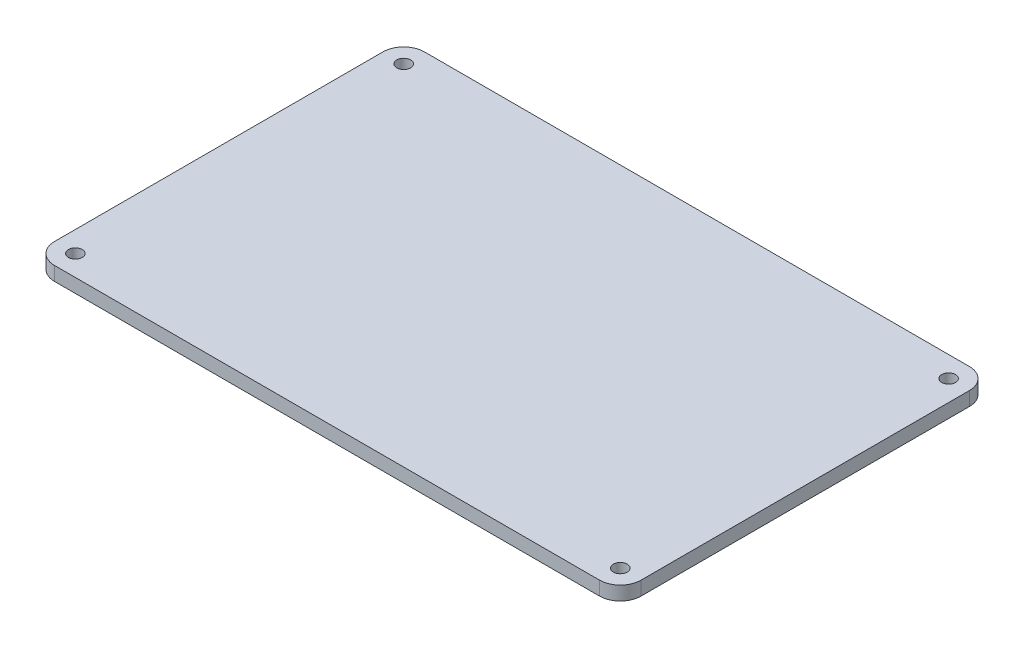
ISO-10303-21;
HEADER;
FILE_DESCRIPTION(('STEP AP214'),'2;1');
FILE_NAME('part.step','',(''),(''),'','','');
FILE_SCHEMA(('AUTOMOTIVE_DESIGN { 1 0 10303 214 1 1 1 1 }'));
ENDSEC;
DATA;
#1=APPLICATION_CONTEXT('core data for automotive mechanical design processes');
#2=APPLICATION_PROTOCOL_DEFINITION('international standard','automotive_design',2000,#1);
#3=PRODUCT_CONTEXT('',#1,'mechanical');
#4=PRODUCT('Part','Part','',(#3));
#5=PRODUCT_RELATED_PRODUCT_CATEGORY('part','',(#4));
#6=PRODUCT_DEFINITION_FORMATION('','',#4);
#7=PRODUCT_DEFINITION_CONTEXT('part definition',#1,'design');
#8=PRODUCT_DEFINITION('design','',#6,#7);
#9=PRODUCT_DEFINITION_SHAPE('','',#8);
#10=(LENGTH_UNIT() NAMED_UNIT(*) SI_UNIT(.MILLI.,.METRE.));
#11=(NAMED_UNIT(*) PLANE_ANGLE_UNIT() SI_UNIT($,.RADIAN.));
#12=(NAMED_UNIT(*) SI_UNIT($,.STERADIAN.) SOLID_ANGLE_UNIT());
#13=UNCERTAINTY_MEASURE_WITH_UNIT(LENGTH_MEASURE(1.E-05),#10,'distance_accuracy_value','');
#14=(GEOMETRIC_REPRESENTATION_CONTEXT(3) GLOBAL_UNCERTAINTY_ASSIGNED_CONTEXT((#13)) GLOBAL_UNIT_ASSIGNED_CONTEXT((#10,
#11,#12)) REPRESENTATION_CONTEXT('',''));
#15=CARTESIAN_POINT('',(0.,0.,0.));
#16=DIRECTION('',(0.,0.,1.));
#17=DIRECTION('',(1.,0.,0.));
#18=AXIS2_PLACEMENT_3D('',#15,#16,#17);
#19=CARTESIAN_POINT('',(-62.1094729976667,3.,5.27128368614883));
#20=DIRECTION('',(0.,1.,0.));
#21=DIRECTION('',(0.,0.,1.));
#22=AXIS2_PLACEMENT_3D('',#19,#20,#21);
#23=PLANE('',#22);
#24=CARTESIAN_POINT('',(-62.1094729976667,3.,5.27128368614883));
#25=DIRECTION('',(0.,1.,0.));
#26=DIRECTION('',(0.,0.,1.));
#27=AXIS2_PLACEMENT_3D('',#24,#25,#26);
#28=CIRCLE('',#27,1.5);
#29=CARTESIAN_POINT('',(-62.1094729976667,3.,6.77128368614884));
#30=VERTEX_POINT('',#29);
#31=EDGE_CURVE('E221',#30,#30,#28,.T.);
#32=ORIENTED_EDGE('',*,*,#31,.F.);
#33=EDGE_LOOP('',(#32));
#34=FACE_BOUND('',#33,.T.);
#35=CARTESIAN_POINT('',(-62.1094729976667,3.,-65.8287163138512));
#36=DIRECTION('',(0.,1.,0.));
#37=DIRECTION('',(0.,0.,1.));
#38=AXIS2_PLACEMENT_3D('',#35,#36,#37);
#39=CIRCLE('',#38,1.5);
#40=CARTESIAN_POINT('',(-62.1094729976667,3.,-64.3287163138512));
#41=VERTEX_POINT('',#40);
#42=EDGE_CURVE('E146',#41,#41,#39,.T.);
#43=ORIENTED_EDGE('',*,*,#42,.F.);
#44=EDGE_LOOP('',(#43));
#45=FACE_BOUND('',#44,.T.);
#46=CARTESIAN_POINT('',(-62.1094729976667,3.,5.27128368614883));
#47=DIRECTION('',(0.,1.,0.));
#48=DIRECTION('',(0.,0.,1.));
#49=AXIS2_PLACEMENT_3D('',#46,#47,#48);
#50=CIRCLE('',#49,4.5);
#51=CARTESIAN_POINT('',(-66.6094729976667,3.,5.27128368614883));
#52=VERTEX_POINT('',#51);
#53=CARTESIAN_POINT('',(-62.1094729976667,3.,9.77128368614883));
#54=VERTEX_POINT('',#53);
#55=EDGE_CURVE('E164',#52,#54,#50,.T.);
#56=ORIENTED_EDGE('',*,*,#55,.T.);
#57=DIRECTION('',(1.,0.,0.));
#58=VECTOR('',#57,1.);
#59=CARTESIAN_POINT('',(-62.1094729976667,3.,9.77128368614883));
#60=LINE('',#59,#58);
#61=CARTESIAN_POINT('',(55.8905270023333,3.,9.77128368614883));
#62=VERTEX_POINT('',#61);
#63=EDGE_CURVE('E100',#54,#62,#60,.T.);
#64=ORIENTED_EDGE('',*,*,#63,.T.);
#65=CARTESIAN_POINT('',(55.8905270023333,3.,5.27128368614883));
#66=DIRECTION('',(0.,1.,0.));
#67=DIRECTION('',(0.,0.,1.));
#68=AXIS2_PLACEMENT_3D('',#65,#66,#67);
#69=CIRCLE('',#68,4.5);
#70=CARTESIAN_POINT('',(60.3905270023333,3.,5.27128368614883));
#71=VERTEX_POINT('',#70);
#72=EDGE_CURVE('E185',#62,#71,#69,.T.);
#73=ORIENTED_EDGE('',*,*,#72,.T.);
#74=DIRECTION('',(0.,0.,-1.));
#75=VECTOR('',#74,1.);
#76=CARTESIAN_POINT('',(60.3905270023333,3.,-65.8287163138512));
#77=LINE('',#76,#75);
#78=CARTESIAN_POINT('',(60.3905270023333,3.,-65.8287163138512));
#79=VERTEX_POINT('',#78);
#80=EDGE_CURVE('E199',#71,#79,#77,.T.);
#81=ORIENTED_EDGE('',*,*,#80,.T.);
#82=CARTESIAN_POINT('',(55.8905270023333,3.,-65.8287163138512));
#83=DIRECTION('',(0.,1.,0.));
#84=DIRECTION('',(0.,0.,1.));
#85=AXIS2_PLACEMENT_3D('',#82,#83,#84);
#86=CIRCLE('',#85,4.5);
#87=CARTESIAN_POINT('',(55.8905270023333,3.,-70.3287163138512));
#88=VERTEX_POINT('',#87);
#89=EDGE_CURVE('E119',#79,#88,#86,.T.);
#90=ORIENTED_EDGE('',*,*,#89,.T.);
#91=DIRECTION('',(-1.,0.,0.));
#92=VECTOR('',#91,1.);
#93=CARTESIAN_POINT('',(-62.1094729976667,3.,-70.3287163138512));
#94=LINE('',#93,#92);
#95=CARTESIAN_POINT('',(-62.1094729976667,3.,-70.3287163138512));
#96=VERTEX_POINT('',#95);
#97=EDGE_CURVE('E113',#88,#96,#94,.T.);
#98=ORIENTED_EDGE('',*,*,#97,.T.);
#99=CARTESIAN_POINT('',(-62.1094729976667,3.,-65.8287163138512));
#100=DIRECTION('',(0.,1.,0.));
#101=DIRECTION('',(0.,0.,1.));
#102=AXIS2_PLACEMENT_3D('',#99,#100,#101);
#103=CIRCLE('',#102,4.5);
#104=CARTESIAN_POINT('',(-66.6094729976667,3.,-65.8287163138512));
#105=VERTEX_POINT('',#104);
#106=EDGE_CURVE('E117',#96,#105,#103,.T.);
#107=ORIENTED_EDGE('',*,*,#106,.T.);
#108=DIRECTION('',(0.,0.,1.));
#109=VECTOR('',#108,1.);
#110=CARTESIAN_POINT('',(-66.6094729976667,3.,5.27128368614883));
#111=LINE('',#110,#109);
#112=EDGE_CURVE('E57',#105,#52,#111,.T.);
#113=ORIENTED_EDGE('',*,*,#112,.T.);
#114=EDGE_LOOP('',(#56,#64,#73,#81,#90,#98,#107,#113));
#115=FACE_BOUND('',#114,.T.);
#116=CARTESIAN_POINT('',(55.8905270023333,3.,-65.8287163138512));
#117=DIRECTION('',(0.,1.,0.));
#118=DIRECTION('',(0.,0.,1.));
#119=AXIS2_PLACEMENT_3D('',#116,#117,#118);
#120=CIRCLE('',#119,1.5);
#121=CARTESIAN_POINT('',(55.8905270023333,3.,-64.3287163138512));
#122=VERTEX_POINT('',#121);
#123=EDGE_CURVE('E213',#122,#122,#120,.T.);
#124=ORIENTED_EDGE('',*,*,#123,.F.);
#125=EDGE_LOOP('',(#124));
#126=FACE_BOUND('',#125,.T.);
#127=CARTESIAN_POINT('',(55.8905270023333,3.,5.27128368614883));
#128=DIRECTION('',(0.,1.,0.));
#129=DIRECTION('',(0.,0.,1.));
#130=AXIS2_PLACEMENT_3D('',#127,#128,#129);
#131=CIRCLE('',#130,1.5);
#132=CARTESIAN_POINT('',(55.8905270023333,3.,6.77128368614884));
#133=VERTEX_POINT('',#132);
#134=EDGE_CURVE('E229',#133,#133,#131,.T.);
#135=ORIENTED_EDGE('',*,*,#134,.F.);
#136=EDGE_LOOP('',(#135));
#137=FACE_BOUND('',#136,.T.);
#138=ADVANCED_FACE('F39',(#34,#45,#115,#126,#137),#23,.T.);
#139=CARTESIAN_POINT('',(-62.1094729976667,0.,5.27128368614883));
#140=DIRECTION('',(0.,1.,0.));
#141=DIRECTION('',(0.,0.,1.));
#142=AXIS2_PLACEMENT_3D('',#139,#140,#141);
#143=PLANE('',#142);
#144=CARTESIAN_POINT('',(-62.1094729976667,0.,5.27128368614883));
#145=DIRECTION('',(0.,1.,0.));
#146=DIRECTION('',(0.,0.,1.));
#147=AXIS2_PLACEMENT_3D('',#144,#145,#146);
#148=CIRCLE('',#147,4.5);
#149=CARTESIAN_POINT('',(-66.6094729976667,0.,5.27128368614883));
#150=VERTEX_POINT('',#149);
#151=CARTESIAN_POINT('',(-62.1094729976667,0.,9.77128368614883));
#152=VERTEX_POINT('',#151);
#153=EDGE_CURVE('E141',#150,#152,#148,.T.);
#154=ORIENTED_EDGE('',*,*,#153,.F.);
#155=DIRECTION('',(0.,0.,1.));
#156=VECTOR('',#155,1.);
#157=CARTESIAN_POINT('',(-66.6094729976667,0.,5.27128368614883));
#158=LINE('',#157,#156);
#159=CARTESIAN_POINT('',(-66.6094729976667,0.,-65.8287163138512));
#160=VERTEX_POINT('',#159);
#161=EDGE_CURVE('E92',#160,#150,#158,.T.);
#162=ORIENTED_EDGE('',*,*,#161,.F.);
#163=CARTESIAN_POINT('',(-62.1094729976667,0.,-65.8287163138512));
#164=DIRECTION('',(0.,1.,0.));
#165=DIRECTION('',(0.,0.,1.));
#166=AXIS2_PLACEMENT_3D('',#163,#164,#165);
#167=CIRCLE('',#166,4.5);
#168=CARTESIAN_POINT('',(-62.1094729976667,0.,-70.3287163138512));
#169=VERTEX_POINT('',#168);
#170=EDGE_CURVE('E86',#169,#160,#167,.T.);
#171=ORIENTED_EDGE('',*,*,#170,.F.);
#172=DIRECTION('',(-1.,0.,0.));
#173=VECTOR('',#172,1.);
#174=CARTESIAN_POINT('',(-62.1094729976667,0.,-70.3287163138512));
#175=LINE('',#174,#173);
#176=CARTESIAN_POINT('',(55.8905270023333,0.,-70.3287163138512));
#177=VERTEX_POINT('',#176);
#178=EDGE_CURVE('E128',#177,#169,#175,.T.);
#179=ORIENTED_EDGE('',*,*,#178,.F.);
#180=CARTESIAN_POINT('',(55.8905270023333,0.,-65.8287163138512));
#181=DIRECTION('',(0.,1.,0.));
#182=DIRECTION('',(0.,0.,1.));
#183=AXIS2_PLACEMENT_3D('',#180,#181,#182);
#184=CIRCLE('',#183,4.5);
#185=CARTESIAN_POINT('',(60.3905270023333,0.,-65.8287163138512));
#186=VERTEX_POINT('',#185);
#187=EDGE_CURVE('E155',#186,#177,#184,.T.);
#188=ORIENTED_EDGE('',*,*,#187,.F.);
#189=DIRECTION('',(0.,0.,-1.));
#190=VECTOR('',#189,1.);
#191=CARTESIAN_POINT('',(60.3905270023333,0.,-65.8287163138512));
#192=LINE('',#191,#190);
#193=CARTESIAN_POINT('',(60.3905270023333,0.,5.27128368614883));
#194=VERTEX_POINT('',#193);
#195=EDGE_CURVE('E152',#194,#186,#192,.T.);
#196=ORIENTED_EDGE('',*,*,#195,.F.);
#197=CARTESIAN_POINT('',(55.8905270023333,0.,5.27128368614883));
#198=DIRECTION('',(0.,1.,0.));
#199=DIRECTION('',(0.,0.,1.));
#200=AXIS2_PLACEMENT_3D('',#197,#198,#199);
#201=CIRCLE('',#200,4.5);
#202=CARTESIAN_POINT('',(55.8905270023333,0.,9.77128368614883));
#203=VERTEX_POINT('',#202);
#204=EDGE_CURVE('E149',#203,#194,#201,.T.);
#205=ORIENTED_EDGE('',*,*,#204,.F.);
#206=DIRECTION('',(1.,0.,0.));
#207=VECTOR('',#206,1.);
#208=CARTESIAN_POINT('',(-62.1094729976667,0.,9.77128368614883));
#209=LINE('',#208,#207);
#210=EDGE_CURVE('E145',#152,#203,#209,.T.);
#211=ORIENTED_EDGE('',*,*,#210,.F.);
#212=EDGE_LOOP('',(#154,#162,#171,#179,#188,#196,#205,#211));
#213=FACE_BOUND('',#212,.T.);
#214=CARTESIAN_POINT('',(-62.1094729976667,0.,-65.8287163138512));
#215=DIRECTION('',(0.,1.,0.));
#216=DIRECTION('',(0.,0.,1.));
#217=AXIS2_PLACEMENT_3D('',#214,#215,#216);
#218=CIRCLE('',#217,1.5);
#219=CARTESIAN_POINT('',(-62.1094729976667,0.,-64.3287163138512));
#220=VERTEX_POINT('',#219);
#221=EDGE_CURVE('E209',#220,#220,#218,.T.);
#222=ORIENTED_EDGE('',*,*,#221,.T.);
#223=EDGE_LOOP('',(#222));
#224=FACE_BOUND('',#223,.T.);
#225=CARTESIAN_POINT('',(55.8905270023333,0.,-65.8287163138512));
#226=DIRECTION('',(0.,1.,0.));
#227=DIRECTION('',(0.,0.,1.));
#228=AXIS2_PLACEMENT_3D('',#225,#226,#227);
#229=CIRCLE('',#228,1.5);
#230=CARTESIAN_POINT('',(55.8905270023333,0.,-64.3287163138512));
#231=VERTEX_POINT('',#230);
#232=EDGE_CURVE('E217',#231,#231,#229,.T.);
#233=ORIENTED_EDGE('',*,*,#232,.T.);
#234=EDGE_LOOP('',(#233));
#235=FACE_BOUND('',#234,.T.);
#236=CARTESIAN_POINT('',(-62.1094729976667,0.,5.27128368614883));
#237=DIRECTION('',(0.,1.,0.));
#238=DIRECTION('',(0.,0.,1.));
#239=AXIS2_PLACEMENT_3D('',#236,#237,#238);
#240=CIRCLE('',#239,1.5);
#241=CARTESIAN_POINT('',(-62.1094729976667,0.,6.77128368614884));
#242=VERTEX_POINT('',#241);
#243=EDGE_CURVE('E225',#242,#242,#240,.T.);
#244=ORIENTED_EDGE('',*,*,#243,.T.);
#245=EDGE_LOOP('',(#244));
#246=FACE_BOUND('',#245,.T.);
#247=CARTESIAN_POINT('',(55.8905270023333,0.,5.27128368614883));
#248=DIRECTION('',(0.,1.,0.));
#249=DIRECTION('',(0.,0.,1.));
#250=AXIS2_PLACEMENT_3D('',#247,#248,#249);
#251=CIRCLE('',#250,1.5);
#252=CARTESIAN_POINT('',(55.8905270023333,0.,6.77128368614884));
#253=VERTEX_POINT('',#252);
#254=EDGE_CURVE('E233',#253,#253,#251,.T.);
#255=ORIENTED_EDGE('',*,*,#254,.T.);
#256=EDGE_LOOP('',(#255));
#257=FACE_BOUND('',#256,.T.);
#258=ADVANCED_FACE('F189',(#213,#224,#235,#246,#257),#143,.F.);
#259=CARTESIAN_POINT('',(-62.1094729976667,3.,5.27128368614883));
#260=DIRECTION('',(0.,-1.,0.));
#261=DIRECTION('',(0.,0.,-1.));
#262=AXIS2_PLACEMENT_3D('',#259,#260,#261);
#263=CYLINDRICAL_SURFACE('',#262,4.5);
#264=ORIENTED_EDGE('',*,*,#153,.T.);
#265=DIRECTION('',(0.,-1.,0.));
#266=VECTOR('',#265,1.);
#267=CARTESIAN_POINT('',(-62.1094729976667,3.,9.77128368614883));
#268=LINE('',#267,#266);
#269=EDGE_CURVE('E11',#54,#152,#268,.T.);
#270=ORIENTED_EDGE('',*,*,#269,.F.);
#271=ORIENTED_EDGE('',*,*,#55,.F.);
#272=DIRECTION('',(0.,-1.,0.));
#273=VECTOR('',#272,1.);
#274=CARTESIAN_POINT('',(-66.6094729976667,3.,5.27128368614883));
#275=LINE('',#274,#273);
#276=EDGE_CURVE('E137',#52,#150,#275,.T.);
#277=ORIENTED_EDGE('',*,*,#276,.T.);
#278=EDGE_LOOP('',(#264,#270,#271,#277));
#279=FACE_BOUND('',#278,.T.);
#280=ADVANCED_FACE('F41',(#279),#263,.T.);
#281=CARTESIAN_POINT('',(-62.1094729976667,3.,9.77128368614883));
#282=DIRECTION('',(0.,0.,-1.));
#283=DIRECTION('',(-1.,0.,0.));
#284=AXIS2_PLACEMENT_3D('',#281,#282,#283);
#285=PLANE('',#284);
#286=ORIENTED_EDGE('',*,*,#210,.T.);
#287=DIRECTION('',(0.,-1.,0.));
#288=VECTOR('',#287,1.);
#289=CARTESIAN_POINT('',(55.8905270023333,3.,9.77128368614883));
#290=LINE('',#289,#288);
#291=EDGE_CURVE('E49',#62,#203,#290,.T.);
#292=ORIENTED_EDGE('',*,*,#291,.F.);
#293=ORIENTED_EDGE('',*,*,#63,.F.);
#294=ORIENTED_EDGE('',*,*,#269,.T.);
#295=EDGE_LOOP('',(#286,#292,#293,#294));
#296=FACE_BOUND('',#295,.T.);
#297=ADVANCED_FACE('F269',(#296),#285,.F.);
#298=CARTESIAN_POINT('',(55.8905270023333,3.,5.27128368614883));
#299=DIRECTION('',(0.,-1.,0.));
#300=DIRECTION('',(0.,0.,-1.));
#301=AXIS2_PLACEMENT_3D('',#298,#299,#300);
#302=CYLINDRICAL_SURFACE('',#301,4.5);
#303=ORIENTED_EDGE('',*,*,#204,.T.);
#304=DIRECTION('',(0.,-1.,0.));
#305=VECTOR('',#304,1.);
#306=CARTESIAN_POINT('',(60.3905270023333,3.,5.27128368614883));
#307=LINE('',#306,#305);
#308=EDGE_CURVE('E175',#71,#194,#307,.T.);
#309=ORIENTED_EDGE('',*,*,#308,.F.);
#310=ORIENTED_EDGE('',*,*,#72,.F.);
#311=ORIENTED_EDGE('',*,*,#291,.T.);
#312=EDGE_LOOP('',(#303,#309,#310,#311));
#313=FACE_BOUND('',#312,.T.);
#314=ADVANCED_FACE('F183',(#313),#302,.T.);
#315=CARTESIAN_POINT('',(60.3905270023333,3.,-65.8287163138512));
#316=DIRECTION('',(-1.,0.,0.));
#317=DIRECTION('',(0.,0.,1.));
#318=AXIS2_PLACEMENT_3D('',#315,#316,#317);
#319=PLANE('',#318);
#320=ORIENTED_EDGE('',*,*,#195,.T.);
#321=DIRECTION('',(0.,-1.,0.));
#322=VECTOR('',#321,1.);
#323=CARTESIAN_POINT('',(60.3905270023333,3.,-65.8287163138512));
#324=LINE('',#323,#322);
#325=EDGE_CURVE('E171',#79,#186,#324,.T.);
#326=ORIENTED_EDGE('',*,*,#325,.F.);
#327=ORIENTED_EDGE('',*,*,#80,.F.);
#328=ORIENTED_EDGE('',*,*,#308,.T.);
#329=EDGE_LOOP('',(#320,#326,#327,#328));
#330=FACE_BOUND('',#329,.T.);
#331=ADVANCED_FACE('F194',(#330),#319,.F.);
#332=CARTESIAN_POINT('',(55.8905270023333,3.,-65.8287163138512));
#333=DIRECTION('',(0.,-1.,0.));
#334=DIRECTION('',(0.,0.,-1.));
#335=AXIS2_PLACEMENT_3D('',#332,#333,#334);
#336=CYLINDRICAL_SURFACE('',#335,4.5);
#337=ORIENTED_EDGE('',*,*,#187,.T.);
#338=DIRECTION('',(0.,-1.,0.));
#339=VECTOR('',#338,1.);
#340=CARTESIAN_POINT('',(55.8905270023333,3.,-70.3287163138512));
#341=LINE('',#340,#339);
#342=EDGE_CURVE('E130',#88,#177,#341,.T.);
#343=ORIENTED_EDGE('',*,*,#342,.F.);
#344=ORIENTED_EDGE('',*,*,#89,.F.);
#345=ORIENTED_EDGE('',*,*,#325,.T.);
#346=EDGE_LOOP('',(#337,#343,#344,#345));
#347=FACE_BOUND('',#346,.T.);
#348=ADVANCED_FACE('F197',(#347),#336,.T.);
#349=CARTESIAN_POINT('',(-62.1094729976667,3.,-70.3287163138512));
#350=DIRECTION('',(0.,0.,1.));
#351=DIRECTION('',(1.,0.,0.));
#352=AXIS2_PLACEMENT_3D('',#349,#350,#351);
#353=PLANE('',#352);
#354=ORIENTED_EDGE('',*,*,#178,.T.);
#355=DIRECTION('',(0.,-1.,0.));
#356=VECTOR('',#355,1.);
#357=CARTESIAN_POINT('',(-62.1094729976667,3.,-70.3287163138512));
#358=LINE('',#357,#356);
#359=EDGE_CURVE('E125',#96,#169,#358,.T.);
#360=ORIENTED_EDGE('',*,*,#359,.F.);
#361=ORIENTED_EDGE('',*,*,#97,.F.);
#362=ORIENTED_EDGE('',*,*,#342,.T.);
#363=EDGE_LOOP('',(#354,#360,#361,#362));
#364=FACE_BOUND('',#363,.T.);
#365=ADVANCED_FACE('F126',(#364),#353,.F.);
#366=CARTESIAN_POINT('',(-62.1094729976667,3.,-65.8287163138512));
#367=DIRECTION('',(0.,-1.,0.));
#368=DIRECTION('',(0.,0.,-1.));
#369=AXIS2_PLACEMENT_3D('',#366,#367,#368);
#370=CYLINDRICAL_SURFACE('',#369,4.5);
#371=ORIENTED_EDGE('',*,*,#170,.T.);
#372=DIRECTION('',(0.,-1.,0.));
#373=VECTOR('',#372,1.);
#374=CARTESIAN_POINT('',(-66.6094729976667,3.,-65.8287163138512));
#375=LINE('',#374,#373);
#376=EDGE_CURVE('E131',#105,#160,#375,.T.);
#377=ORIENTED_EDGE('',*,*,#376,.F.);
#378=ORIENTED_EDGE('',*,*,#106,.F.);
#379=ORIENTED_EDGE('',*,*,#359,.T.);
#380=EDGE_LOOP('',(#371,#377,#378,#379));
#381=FACE_BOUND('',#380,.T.);
#382=ADVANCED_FACE('F133',(#381),#370,.T.);
#383=CARTESIAN_POINT('',(-66.6094729976667,3.,5.27128368614883));
#384=DIRECTION('',(1.,0.,0.));
#385=DIRECTION('',(0.,0.,-1.));
#386=AXIS2_PLACEMENT_3D('',#383,#384,#385);
#387=PLANE('',#386);
#388=ORIENTED_EDGE('',*,*,#161,.T.);
#389=ORIENTED_EDGE('',*,*,#276,.F.);
#390=ORIENTED_EDGE('',*,*,#112,.F.);
#391=ORIENTED_EDGE('',*,*,#376,.T.);
#392=EDGE_LOOP('',(#388,#389,#390,#391));
#393=FACE_BOUND('',#392,.T.);
#394=ADVANCED_FACE('F257',(#393),#387,.F.);
#395=CARTESIAN_POINT('',(-62.1094729976667,3.,-65.8287163138512));
#396=DIRECTION('',(0.,-1.,0.));
#397=DIRECTION('',(0.,0.,-1.));
#398=AXIS2_PLACEMENT_3D('',#395,#396,#397);
#399=CYLINDRICAL_SURFACE('',#398,1.5);
#400=ORIENTED_EDGE('',*,*,#42,.T.);
#401=EDGE_LOOP('',(#400));
#402=FACE_BOUND('',#401,.T.);
#403=ORIENTED_EDGE('',*,*,#221,.F.);
#404=EDGE_LOOP('',(#403));
#405=FACE_BOUND('',#404,.T.);
#406=ADVANCED_FACE('F254',(#402,#405),#399,.F.);
#407=CARTESIAN_POINT('',(55.8905270023333,3.,-65.8287163138512));
#408=DIRECTION('',(0.,-1.,0.));
#409=DIRECTION('',(0.,0.,-1.));
#410=AXIS2_PLACEMENT_3D('',#407,#408,#409);
#411=CYLINDRICAL_SURFACE('',#410,1.5);
#412=ORIENTED_EDGE('',*,*,#123,.T.);
#413=EDGE_LOOP('',(#412));
#414=FACE_BOUND('',#413,.T.);
#415=ORIENTED_EDGE('',*,*,#232,.F.);
#416=EDGE_LOOP('',(#415));
#417=FACE_BOUND('',#416,.T.);
#418=ADVANCED_FACE('F333',(#414,#417),#411,.F.);
#419=CARTESIAN_POINT('',(-62.1094729976667,3.,5.27128368614883));
#420=DIRECTION('',(0.,-1.,0.));
#421=DIRECTION('',(0.,0.,-1.));
#422=AXIS2_PLACEMENT_3D('',#419,#420,#421);
#423=CYLINDRICAL_SURFACE('',#422,1.5);
#424=ORIENTED_EDGE('',*,*,#31,.T.);
#425=EDGE_LOOP('',(#424));
#426=FACE_BOUND('',#425,.T.);
#427=ORIENTED_EDGE('',*,*,#243,.F.);
#428=EDGE_LOOP('',(#427));
#429=FACE_BOUND('',#428,.T.);
#430=ADVANCED_FACE('F341',(#426,#429),#423,.F.);
#431=CARTESIAN_POINT('',(55.8905270023333,3.,5.27128368614883));
#432=DIRECTION('',(0.,-1.,0.));
#433=DIRECTION('',(0.,0.,-1.));
#434=AXIS2_PLACEMENT_3D('',#431,#432,#433);
#435=CYLINDRICAL_SURFACE('',#434,1.5);
#436=ORIENTED_EDGE('',*,*,#134,.T.);
#437=EDGE_LOOP('',(#436));
#438=FACE_BOUND('',#437,.T.);
#439=ORIENTED_EDGE('',*,*,#254,.F.);
#440=EDGE_LOOP('',(#439));
#441=FACE_BOUND('',#440,.T.);
#442=ADVANCED_FACE('F241',(#438,#441),#435,.F.);
#443=CLOSED_SHELL('',(#138,#258,#280,#297,#314,#331,#348,#365,#382,#394,#406,#418,#430,#442));
#444=MANIFOLD_SOLID_BREP('B2',#443);
#445=ADVANCED_BREP_SHAPE_REPRESENTATION('',(#18,#444),#14);
#446=SHAPE_DEFINITION_REPRESENTATION(#9,#445);
ENDSEC;
END-ISO-10303-21;
